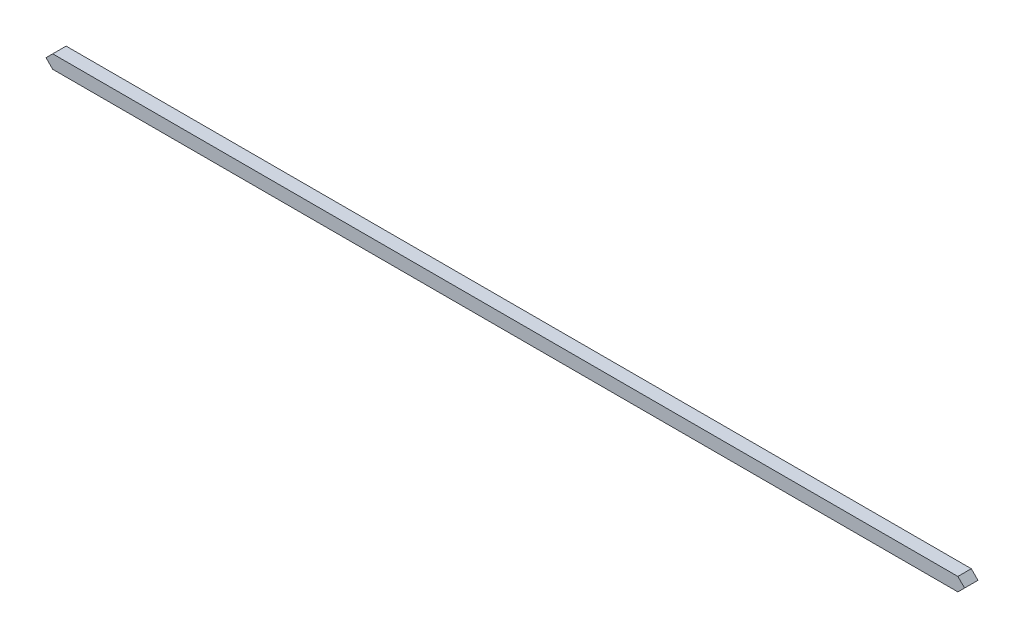
ISO-10303-21;
HEADER;
FILE_DESCRIPTION(('STEP AP214'),'2;1');
FILE_NAME('part.step','',(''),(''),'','','');
FILE_SCHEMA(('AUTOMOTIVE_DESIGN { 1 0 10303 214 1 1 1 1 }'));
ENDSEC;
DATA;
#1=APPLICATION_CONTEXT('core data for automotive mechanical design processes');
#2=APPLICATION_PROTOCOL_DEFINITION('international standard','automotive_design',2000,#1);
#3=PRODUCT_CONTEXT('',#1,'mechanical');
#4=PRODUCT('Part','Part','',(#3));
#5=PRODUCT_RELATED_PRODUCT_CATEGORY('part','',(#4));
#6=PRODUCT_DEFINITION_FORMATION('','',#4);
#7=PRODUCT_DEFINITION_CONTEXT('part definition',#1,'design');
#8=PRODUCT_DEFINITION('design','',#6,#7);
#9=PRODUCT_DEFINITION_SHAPE('','',#8);
#10=(LENGTH_UNIT() NAMED_UNIT(*) SI_UNIT(.MILLI.,.METRE.));
#11=(NAMED_UNIT(*) PLANE_ANGLE_UNIT() SI_UNIT($,.RADIAN.));
#12=(NAMED_UNIT(*) SI_UNIT($,.STERADIAN.) SOLID_ANGLE_UNIT());
#13=UNCERTAINTY_MEASURE_WITH_UNIT(LENGTH_MEASURE(1.E-05),#10,'distance_accuracy_value','');
#14=(GEOMETRIC_REPRESENTATION_CONTEXT(3) GLOBAL_UNCERTAINTY_ASSIGNED_CONTEXT((#13)) GLOBAL_UNIT_ASSIGNED_CONTEXT((#10,
#11,#12)) REPRESENTATION_CONTEXT('',''));
#15=CARTESIAN_POINT('',(0.,0.,0.));
#16=DIRECTION('',(0.,0.,1.));
#17=DIRECTION('',(1.,0.,0.));
#18=AXIS2_PLACEMENT_3D('',#15,#16,#17);
#19=CARTESIAN_POINT('',(-1369.99999999999,0.,40.));
#20=DIRECTION('',(0.707106781186732,0.707106781186363,0.));
#21=DIRECTION('',(-0.707106781186363,0.707106781186732,0.));
#22=AXIS2_PLACEMENT_3D('',#19,#20,#21);
#23=PLANE('',#22);
#24=DIRECTION('',(0.707106781186363,-0.707106781186732,0.));
#25=VECTOR('',#24,1.);
#26=CARTESIAN_POINT('',(-1369.99999999999,0.,0.));
#27=LINE('',#26,#25);
#28=CARTESIAN_POINT('',(-1369.99999999999,0.,0.));
#29=VERTEX_POINT('',#28);
#30=CARTESIAN_POINT('',(-1350.,-20.,0.));
#31=VERTEX_POINT('',#30);
#32=EDGE_CURVE('E128',#29,#31,#27,.T.);
#33=ORIENTED_EDGE('',*,*,#32,.T.);
#34=DIRECTION('',(0.,0.,-1.));
#35=VECTOR('',#34,1.);
#36=CARTESIAN_POINT('',(-1350.,-20.,40.));
#37=LINE('',#36,#35);
#38=CARTESIAN_POINT('',(-1350.,-20.,40.));
#39=VERTEX_POINT('',#38);
#40=EDGE_CURVE('E11',#39,#31,#37,.T.);
#41=ORIENTED_EDGE('',*,*,#40,.F.);
#42=DIRECTION('',(0.707106781186363,-0.707106781186732,0.));
#43=VECTOR('',#42,1.);
#44=CARTESIAN_POINT('',(-1369.99999999999,0.,40.));
#45=LINE('',#44,#43);
#46=CARTESIAN_POINT('',(-1369.99999999999,0.,40.));
#47=VERTEX_POINT('',#46);
#48=EDGE_CURVE('E144',#47,#39,#45,.T.);
#49=ORIENTED_EDGE('',*,*,#48,.F.);
#50=DIRECTION('',(0.,0.,-1.));
#51=VECTOR('',#50,1.);
#52=CARTESIAN_POINT('',(-1369.99999999999,0.,40.));
#53=LINE('',#52,#51);
#54=EDGE_CURVE('E124',#47,#29,#53,.T.);
#55=ORIENTED_EDGE('',*,*,#54,.T.);
#56=EDGE_LOOP('',(#33,#41,#49,#55));
#57=FACE_BOUND('',#56,.T.);
#58=ADVANCED_FACE('F39',(#57),#23,.F.);
#59=CARTESIAN_POINT('',(-1350.,-20.,40.));
#60=DIRECTION('',(0.,1.,0.));
#61=DIRECTION('',(0.,0.,1.));
#62=AXIS2_PLACEMENT_3D('',#59,#60,#61);
#63=PLANE('',#62);
#64=DIRECTION('',(1.,0.,0.));
#65=VECTOR('',#64,1.);
#66=CARTESIAN_POINT('',(-1350.,-20.,0.));
#67=LINE('',#66,#65);
#68=CARTESIAN_POINT('',(1350.,-20.,0.));
#69=VERTEX_POINT('',#68);
#70=EDGE_CURVE('E132',#31,#69,#67,.T.);
#71=ORIENTED_EDGE('',*,*,#70,.T.);
#72=DIRECTION('',(0.,0.,-1.));
#73=VECTOR('',#72,1.);
#74=CARTESIAN_POINT('',(1350.,-20.,40.));
#75=LINE('',#74,#73);
#76=CARTESIAN_POINT('',(1350.,-20.,40.));
#77=VERTEX_POINT('',#76);
#78=EDGE_CURVE('E48',#77,#69,#75,.T.);
#79=ORIENTED_EDGE('',*,*,#78,.F.);
#80=DIRECTION('',(1.,0.,0.));
#81=VECTOR('',#80,1.);
#82=CARTESIAN_POINT('',(-1350.,-20.,40.));
#83=LINE('',#82,#81);
#84=EDGE_CURVE('E93',#39,#77,#83,.T.);
#85=ORIENTED_EDGE('',*,*,#84,.F.);
#86=ORIENTED_EDGE('',*,*,#40,.T.);
#87=EDGE_LOOP('',(#71,#79,#85,#86));
#88=FACE_BOUND('',#87,.T.);
#89=ADVANCED_FACE('F172',(#88),#63,.F.);
#90=CARTESIAN_POINT('',(1369.99999999999,0.,40.));
#91=DIRECTION('',(-0.70710678118674,0.707106781186356,0.));
#92=DIRECTION('',(-0.707106781186356,-0.70710678118674,0.));
#93=AXIS2_PLACEMENT_3D('',#90,#91,#92);
#94=PLANE('',#93);
#95=DIRECTION('',(0.707106781186355,0.707106781186739,0.));
#96=VECTOR('',#95,1.);
#97=CARTESIAN_POINT('',(1369.99999999999,0.,0.));
#98=LINE('',#97,#96);
#99=CARTESIAN_POINT('',(1369.99999999999,0.,0.));
#100=VERTEX_POINT('',#99);
#101=EDGE_CURVE('E135',#69,#100,#98,.T.);
#102=ORIENTED_EDGE('',*,*,#101,.T.);
#103=DIRECTION('',(0.,0.,-1.));
#104=VECTOR('',#103,1.);
#105=CARTESIAN_POINT('',(1369.99999999999,0.,40.));
#106=LINE('',#105,#104);
#107=CARTESIAN_POINT('',(1369.99999999999,0.,40.));
#108=VERTEX_POINT('',#107);
#109=EDGE_CURVE('E117',#108,#100,#106,.T.);
#110=ORIENTED_EDGE('',*,*,#109,.F.);
#111=DIRECTION('',(0.707106781186355,0.707106781186739,0.));
#112=VECTOR('',#111,1.);
#113=CARTESIAN_POINT('',(1369.99999999999,0.,40.));
#114=LINE('',#113,#112);
#115=EDGE_CURVE('E106',#77,#108,#114,.T.);
#116=ORIENTED_EDGE('',*,*,#115,.F.);
#117=ORIENTED_EDGE('',*,*,#78,.T.);
#118=EDGE_LOOP('',(#102,#110,#116,#117));
#119=FACE_BOUND('',#118,.T.);
#120=ADVANCED_FACE('F154',(#119),#94,.F.);
#121=CARTESIAN_POINT('',(1369.99999999999,0.,40.));
#122=DIRECTION('',(-0.70710678118674,-0.707106781186356,0.));
#123=DIRECTION('',(0.707106781186356,-0.70710678118674,0.));
#124=AXIS2_PLACEMENT_3D('',#121,#122,#123);
#125=PLANE('',#124);
#126=DIRECTION('',(-0.707106781186355,0.707106781186739,0.));
#127=VECTOR('',#126,1.);
#128=CARTESIAN_POINT('',(1369.99999999999,0.,0.));
#129=LINE('',#128,#127);
#130=CARTESIAN_POINT('',(1350.,20.,0.));
#131=VERTEX_POINT('',#130);
#132=EDGE_CURVE('E115',#100,#131,#129,.T.);
#133=ORIENTED_EDGE('',*,*,#132,.T.);
#134=DIRECTION('',(0.,0.,-1.));
#135=VECTOR('',#134,1.);
#136=CARTESIAN_POINT('',(1350.,20.,40.));
#137=LINE('',#136,#135);
#138=CARTESIAN_POINT('',(1350.,20.,40.));
#139=VERTEX_POINT('',#138);
#140=EDGE_CURVE('E112',#139,#131,#137,.T.);
#141=ORIENTED_EDGE('',*,*,#140,.F.);
#142=DIRECTION('',(-0.707106781186355,0.707106781186739,0.));
#143=VECTOR('',#142,1.);
#144=CARTESIAN_POINT('',(1369.99999999999,0.,40.));
#145=LINE('',#144,#143);
#146=EDGE_CURVE('E100',#108,#139,#145,.T.);
#147=ORIENTED_EDGE('',*,*,#146,.F.);
#148=ORIENTED_EDGE('',*,*,#109,.T.);
#149=EDGE_LOOP('',(#133,#141,#147,#148));
#150=FACE_BOUND('',#149,.T.);
#151=ADVANCED_FACE('F113',(#150),#125,.F.);
#152=CARTESIAN_POINT('',(-1350.,20.,40.));
#153=DIRECTION('',(0.,-1.,0.));
#154=DIRECTION('',(0.,0.,-1.));
#155=AXIS2_PLACEMENT_3D('',#152,#153,#154);
#156=PLANE('',#155);
#157=DIRECTION('',(-1.,0.,0.));
#158=VECTOR('',#157,1.);
#159=CARTESIAN_POINT('',(-1350.,20.,0.));
#160=LINE('',#159,#158);
#161=CARTESIAN_POINT('',(-1350.,20.,0.));
#162=VERTEX_POINT('',#161);
#163=EDGE_CURVE('E79',#131,#162,#160,.T.);
#164=ORIENTED_EDGE('',*,*,#163,.T.);
#165=DIRECTION('',(0.,0.,-1.));
#166=VECTOR('',#165,1.);
#167=CARTESIAN_POINT('',(-1350.,20.,40.));
#168=LINE('',#167,#166);
#169=CARTESIAN_POINT('',(-1350.,20.,40.));
#170=VERTEX_POINT('',#169);
#171=EDGE_CURVE('E118',#170,#162,#168,.T.);
#172=ORIENTED_EDGE('',*,*,#171,.F.);
#173=DIRECTION('',(-1.,0.,0.));
#174=VECTOR('',#173,1.);
#175=CARTESIAN_POINT('',(-1350.,20.,40.));
#176=LINE('',#175,#174);
#177=EDGE_CURVE('E104',#139,#170,#176,.T.);
#178=ORIENTED_EDGE('',*,*,#177,.F.);
#179=ORIENTED_EDGE('',*,*,#140,.T.);
#180=EDGE_LOOP('',(#164,#172,#178,#179));
#181=FACE_BOUND('',#180,.T.);
#182=ADVANCED_FACE('F120',(#181),#156,.F.);
#183=CARTESIAN_POINT('',(-1369.99999999999,0.,40.));
#184=DIRECTION('',(0.707106781186732,-0.707106781186363,0.));
#185=DIRECTION('',(0.707106781186363,0.707106781186732,0.));
#186=AXIS2_PLACEMENT_3D('',#183,#184,#185);
#187=PLANE('',#186);
#188=DIRECTION('',(-0.707106781186363,-0.707106781186732,0.));
#189=VECTOR('',#188,1.);
#190=CARTESIAN_POINT('',(-1369.99999999999,0.,0.));
#191=LINE('',#190,#189);
#192=EDGE_CURVE('E85',#162,#29,#191,.T.);
#193=ORIENTED_EDGE('',*,*,#192,.T.);
#194=ORIENTED_EDGE('',*,*,#54,.F.);
#195=DIRECTION('',(-0.707106781186363,-0.707106781186732,0.));
#196=VECTOR('',#195,1.);
#197=CARTESIAN_POINT('',(-1369.99999999999,0.,40.));
#198=LINE('',#197,#196);
#199=EDGE_CURVE('E56',#170,#47,#198,.T.);
#200=ORIENTED_EDGE('',*,*,#199,.F.);
#201=ORIENTED_EDGE('',*,*,#171,.T.);
#202=EDGE_LOOP('',(#193,#194,#200,#201));
#203=FACE_BOUND('',#202,.T.);
#204=ADVANCED_FACE('F161',(#203),#187,.F.);
#205=CARTESIAN_POINT('',(0.,0.,40.));
#206=DIRECTION('',(0.,0.,-1.));
#207=DIRECTION('',(-1.,0.,0.));
#208=AXIS2_PLACEMENT_3D('',#205,#206,#207);
#209=PLANE('',#208);
#210=ORIENTED_EDGE('',*,*,#48,.T.);
#211=ORIENTED_EDGE('',*,*,#84,.T.);
#212=ORIENTED_EDGE('',*,*,#115,.T.);
#213=ORIENTED_EDGE('',*,*,#146,.T.);
#214=ORIENTED_EDGE('',*,*,#177,.T.);
#215=ORIENTED_EDGE('',*,*,#199,.T.);
#216=EDGE_LOOP('',(#210,#211,#212,#213,#214,#215));
#217=FACE_BOUND('',#216,.T.);
#218=ADVANCED_FACE('F102',(#217),#209,.F.);
#219=CARTESIAN_POINT('',(0.,0.,0.));
#220=DIRECTION('',(0.,0.,-1.));
#221=DIRECTION('',(-1.,0.,0.));
#222=AXIS2_PLACEMENT_3D('',#219,#220,#221);
#223=PLANE('',#222);
#224=ORIENTED_EDGE('',*,*,#32,.F.);
#225=ORIENTED_EDGE('',*,*,#192,.F.);
#226=ORIENTED_EDGE('',*,*,#163,.F.);
#227=ORIENTED_EDGE('',*,*,#132,.F.);
#228=ORIENTED_EDGE('',*,*,#101,.F.);
#229=ORIENTED_EDGE('',*,*,#70,.F.);
#230=EDGE_LOOP('',(#224,#225,#226,#227,#228,#229));
#231=FACE_BOUND('',#230,.T.);
#232=ADVANCED_FACE('F157',(#231),#223,.T.);
#233=CLOSED_SHELL('',(#58,#89,#120,#151,#182,#204,#218,#232));
#234=MANIFOLD_SOLID_BREP('B2',#233);
#235=ADVANCED_BREP_SHAPE_REPRESENTATION('',(#18,#234),#14);
#236=SHAPE_DEFINITION_REPRESENTATION(#9,#235);
ENDSEC;
END-ISO-10303-21;
